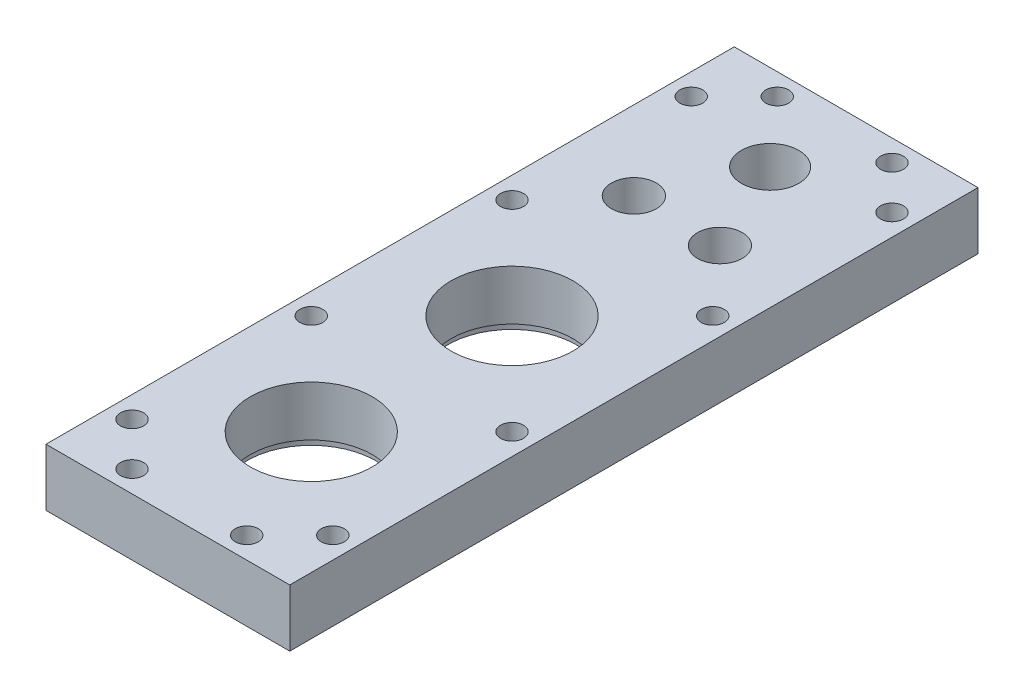
ISO-10303-21;
HEADER;
FILE_DESCRIPTION(('STEP AP214'),'2;1');
FILE_NAME('part.step','',(''),(''),'','','');
FILE_SCHEMA(('AUTOMOTIVE_DESIGN { 1 0 10303 214 1 1 1 1 }'));
ENDSEC;
DATA;
#1=APPLICATION_CONTEXT('core data for automotive mechanical design processes');
#2=APPLICATION_PROTOCOL_DEFINITION('international standard','automotive_design',2000,#1);
#3=PRODUCT_CONTEXT('',#1,'mechanical');
#4=PRODUCT('Part','Part','',(#3));
#5=PRODUCT_RELATED_PRODUCT_CATEGORY('part','',(#4));
#6=PRODUCT_DEFINITION_FORMATION('','',#4);
#7=PRODUCT_DEFINITION_CONTEXT('part definition',#1,'design');
#8=PRODUCT_DEFINITION('design','',#6,#7);
#9=PRODUCT_DEFINITION_SHAPE('','',#8);
#10=(LENGTH_UNIT() NAMED_UNIT(*) SI_UNIT(.MILLI.,.METRE.));
#11=(NAMED_UNIT(*) PLANE_ANGLE_UNIT() SI_UNIT($,.RADIAN.));
#12=(NAMED_UNIT(*) SI_UNIT($,.STERADIAN.) SOLID_ANGLE_UNIT());
#13=UNCERTAINTY_MEASURE_WITH_UNIT(LENGTH_MEASURE(1.E-05),#10,'distance_accuracy_value','');
#14=(GEOMETRIC_REPRESENTATION_CONTEXT(3) GLOBAL_UNCERTAINTY_ASSIGNED_CONTEXT((#13)) GLOBAL_UNIT_ASSIGNED_CONTEXT((#10,
#11,#12)) REPRESENTATION_CONTEXT('',''));
#15=CARTESIAN_POINT('',(0.,0.,0.));
#16=DIRECTION('',(0.,0.,1.));
#17=DIRECTION('',(1.,0.,0.));
#18=AXIS2_PLACEMENT_3D('',#15,#16,#17);
#19=CARTESIAN_POINT('',(0.,0.,-20.));
#20=DIRECTION('',(0.,1.,0.));
#21=DIRECTION('',(-1.,0.,0.));
#22=AXIS2_PLACEMENT_3D('',#19,#20,#21);
#23=CYLINDRICAL_SURFACE('',#22,9.);
#24=CARTESIAN_POINT('',(0.,0.,-20.));
#25=DIRECTION('',(0.,1.,0.));
#26=DIRECTION('',(-1.,0.,0.));
#27=AXIS2_PLACEMENT_3D('',#24,#25,#26);
#28=CIRCLE('',#27,9.);
#29=CARTESIAN_POINT('',(9.,0.,-20.));
#30=VERTEX_POINT('',#29);
#31=EDGE_CURVE('E251',#30,#30,#28,.T.);
#32=ORIENTED_EDGE('',*,*,#31,.F.);
#33=DIRECTION('',(0.,1.,0.));
#34=VECTOR('',#33,1.);
#35=CARTESIAN_POINT('',(9.,0.,-20.));
#36=LINE('',#35,#34);
#37=CARTESIAN_POINT('',(9.,1.,-20.));
#38=VERTEX_POINT('',#37);
#39=EDGE_CURVE('E11',#30,#38,#36,.T.);
#40=ORIENTED_EDGE('',*,*,#39,.T.);
#41=CARTESIAN_POINT('',(0.,1.,-20.));
#42=DIRECTION('',(0.,1.,0.));
#43=DIRECTION('',(-1.,0.,0.));
#44=AXIS2_PLACEMENT_3D('',#41,#42,#43);
#45=CIRCLE('',#44,9.);
#46=EDGE_CURVE('E28',#38,#38,#45,.T.);
#47=ORIENTED_EDGE('',*,*,#46,.T.);
#48=ORIENTED_EDGE('',*,*,#39,.F.);
#49=EDGE_LOOP('',(#32,#40,#47,#48));
#50=FACE_BOUND('',#49,.T.);
#51=ADVANCED_FACE('F17',(#50),#23,.F.);
#52=CARTESIAN_POINT('',(0.,1.,-20.));
#53=DIRECTION('',(0.,1.,0.));
#54=DIRECTION('',(1.,0.,0.));
#55=AXIS2_PLACEMENT_3D('',#52,#53,#54);
#56=PLANE('',#55);
#57=CARTESIAN_POINT('',(0.,1.,-20.));
#58=DIRECTION('',(0.,1.,0.));
#59=DIRECTION('',(1.,0.,0.));
#60=AXIS2_PLACEMENT_3D('',#57,#58,#59);
#61=CIRCLE('',#60,8.5);
#62=CARTESIAN_POINT('',(-8.5,1.,-20.));
#63=VERTEX_POINT('',#62);
#64=EDGE_CURVE('E358',#63,#63,#61,.T.);
#65=ORIENTED_EDGE('',*,*,#64,.T.);
#66=EDGE_LOOP('',(#65));
#67=FACE_BOUND('',#66,.T.);
#68=ORIENTED_EDGE('',*,*,#46,.F.);
#69=EDGE_LOOP('',(#68));
#70=FACE_BOUND('',#69,.T.);
#71=ADVANCED_FACE('F612',(#67,#70),#56,.F.);
#72=CARTESIAN_POINT('',(0.,-5.762681024821,-20.));
#73=DIRECTION('',(0.,1.,0.));
#74=DIRECTION('',(1.,0.,0.));
#75=AXIS2_PLACEMENT_3D('',#72,#73,#74);
#76=CYLINDRICAL_SURFACE('',#75,8.5);
#77=ORIENTED_EDGE('',*,*,#64,.F.);
#78=DIRECTION('',(0.,1.,0.));
#79=VECTOR('',#78,1.);
#80=CARTESIAN_POINT('',(-8.5,-5.762681024821,-20.));
#81=LINE('',#80,#79);
#82=CARTESIAN_POINT('',(-8.5,8.,-20.));
#83=VERTEX_POINT('',#82);
#84=EDGE_CURVE('E411',#63,#83,#81,.T.);
#85=ORIENTED_EDGE('',*,*,#84,.T.);
#86=CARTESIAN_POINT('',(0.,8.,-20.));
#87=DIRECTION('',(0.,1.,0.));
#88=DIRECTION('',(1.,0.,0.));
#89=AXIS2_PLACEMENT_3D('',#86,#87,#88);
#90=CIRCLE('',#89,8.5);
#91=EDGE_CURVE('E281',#83,#83,#90,.T.);
#92=ORIENTED_EDGE('',*,*,#91,.T.);
#93=ORIENTED_EDGE('',*,*,#84,.F.);
#94=EDGE_LOOP('',(#77,#85,#92,#93));
#95=FACE_BOUND('',#94,.T.);
#96=ADVANCED_FACE('F19',(#95),#76,.F.);
#97=CARTESIAN_POINT('',(0.,0.,-48.));
#98=DIRECTION('',(0.,1.,0.));
#99=DIRECTION('',(-1.,0.,0.));
#100=AXIS2_PLACEMENT_3D('',#97,#98,#99);
#101=CYLINDRICAL_SURFACE('',#100,9.);
#102=CARTESIAN_POINT('',(0.,0.,-48.));
#103=DIRECTION('',(0.,1.,0.));
#104=DIRECTION('',(-1.,0.,0.));
#105=AXIS2_PLACEMENT_3D('',#102,#103,#104);
#106=CIRCLE('',#105,9.);
#107=CARTESIAN_POINT('',(9.,0.,-48.));
#108=VERTEX_POINT('',#107);
#109=EDGE_CURVE('E241',#108,#108,#106,.T.);
#110=ORIENTED_EDGE('',*,*,#109,.F.);
#111=DIRECTION('',(0.,1.,0.));
#112=VECTOR('',#111,1.);
#113=CARTESIAN_POINT('',(9.,0.,-48.));
#114=LINE('',#113,#112);
#115=CARTESIAN_POINT('',(9.,1.,-48.));
#116=VERTEX_POINT('',#115);
#117=EDGE_CURVE('E307',#108,#116,#114,.T.);
#118=ORIENTED_EDGE('',*,*,#117,.T.);
#119=CARTESIAN_POINT('',(0.,1.,-48.));
#120=DIRECTION('',(0.,1.,0.));
#121=DIRECTION('',(-1.,0.,0.));
#122=AXIS2_PLACEMENT_3D('',#119,#120,#121);
#123=CIRCLE('',#122,9.);
#124=EDGE_CURVE('E303',#116,#116,#123,.T.);
#125=ORIENTED_EDGE('',*,*,#124,.T.);
#126=ORIENTED_EDGE('',*,*,#117,.F.);
#127=EDGE_LOOP('',(#110,#118,#125,#126));
#128=FACE_BOUND('',#127,.T.);
#129=ADVANCED_FACE('F697',(#128),#101,.F.);
#130=CARTESIAN_POINT('',(0.,1.,-48.));
#131=DIRECTION('',(0.,1.,0.));
#132=DIRECTION('',(1.,0.,0.));
#133=AXIS2_PLACEMENT_3D('',#130,#131,#132);
#134=PLANE('',#133);
#135=CARTESIAN_POINT('',(0.,1.,-48.));
#136=DIRECTION('',(0.,1.,0.));
#137=DIRECTION('',(1.,0.,0.));
#138=AXIS2_PLACEMENT_3D('',#135,#136,#137);
#139=CIRCLE('',#138,8.5);
#140=CARTESIAN_POINT('',(-8.5,1.,-48.));
#141=VERTEX_POINT('',#140);
#142=EDGE_CURVE('E398',#141,#141,#139,.T.);
#143=ORIENTED_EDGE('',*,*,#142,.T.);
#144=EDGE_LOOP('',(#143));
#145=FACE_BOUND('',#144,.T.);
#146=ORIENTED_EDGE('',*,*,#124,.F.);
#147=EDGE_LOOP('',(#146));
#148=FACE_BOUND('',#147,.T.);
#149=ADVANCED_FACE('F639',(#145,#148),#134,.F.);
#150=CARTESIAN_POINT('',(0.,-5.762681024821,-48.));
#151=DIRECTION('',(0.,1.,0.));
#152=DIRECTION('',(1.,0.,0.));
#153=AXIS2_PLACEMENT_3D('',#150,#151,#152);
#154=CYLINDRICAL_SURFACE('',#153,8.5);
#155=ORIENTED_EDGE('',*,*,#142,.F.);
#156=DIRECTION('',(0.,1.,0.));
#157=VECTOR('',#156,1.);
#158=CARTESIAN_POINT('',(-8.5,-5.762681024821,-48.));
#159=LINE('',#158,#157);
#160=CARTESIAN_POINT('',(-8.5,8.,-48.));
#161=VERTEX_POINT('',#160);
#162=EDGE_CURVE('E308',#141,#161,#159,.T.);
#163=ORIENTED_EDGE('',*,*,#162,.T.);
#164=CARTESIAN_POINT('',(0.,8.,-48.));
#165=DIRECTION('',(0.,1.,0.));
#166=DIRECTION('',(1.,0.,0.));
#167=AXIS2_PLACEMENT_3D('',#164,#165,#166);
#168=CIRCLE('',#167,8.5);
#169=EDGE_CURVE('E286',#161,#161,#168,.T.);
#170=ORIENTED_EDGE('',*,*,#169,.T.);
#171=ORIENTED_EDGE('',*,*,#162,.F.);
#172=EDGE_LOOP('',(#155,#163,#170,#171));
#173=FACE_BOUND('',#172,.T.);
#174=ADVANCED_FACE('F704',(#173),#154,.F.);
#175=CARTESIAN_POINT('',(6.,0.,-71.));
#176=DIRECTION('',(0.,1.,0.));
#177=DIRECTION('',(-1.,0.,0.));
#178=AXIS2_PLACEMENT_3D('',#175,#176,#177);
#179=CYLINDRICAL_SURFACE('',#178,3.6);
#180=CARTESIAN_POINT('',(6.,0.,-71.));
#181=DIRECTION('',(0.,1.,0.));
#182=DIRECTION('',(-1.,0.,0.));
#183=AXIS2_PLACEMENT_3D('',#180,#181,#182);
#184=CIRCLE('',#183,3.6);
#185=CARTESIAN_POINT('',(9.6,0.,-71.));
#186=VERTEX_POINT('',#185);
#187=EDGE_CURVE('E215',#186,#186,#184,.T.);
#188=ORIENTED_EDGE('',*,*,#187,.F.);
#189=DIRECTION('',(0.,1.,0.));
#190=VECTOR('',#189,1.);
#191=CARTESIAN_POINT('',(9.6,0.,-71.));
#192=LINE('',#191,#190);
#193=CARTESIAN_POINT('',(9.6,1.,-71.));
#194=VERTEX_POINT('',#193);
#195=EDGE_CURVE('E237',#186,#194,#192,.T.);
#196=ORIENTED_EDGE('',*,*,#195,.T.);
#197=CARTESIAN_POINT('',(6.,1.,-71.));
#198=DIRECTION('',(0.,1.,0.));
#199=DIRECTION('',(-1.,0.,0.));
#200=AXIS2_PLACEMENT_3D('',#197,#198,#199);
#201=CIRCLE('',#200,3.6);
#202=EDGE_CURVE('E233',#194,#194,#201,.T.);
#203=ORIENTED_EDGE('',*,*,#202,.T.);
#204=ORIENTED_EDGE('',*,*,#195,.F.);
#205=EDGE_LOOP('',(#188,#196,#203,#204));
#206=FACE_BOUND('',#205,.T.);
#207=ADVANCED_FACE('F662',(#206),#179,.F.);
#208=CARTESIAN_POINT('',(6.,1.,-71.));
#209=DIRECTION('',(0.,1.,0.));
#210=DIRECTION('',(1.,0.,0.));
#211=AXIS2_PLACEMENT_3D('',#208,#209,#210);
#212=PLANE('',#211);
#213=CARTESIAN_POINT('',(6.,1.,-71.));
#214=DIRECTION('',(0.,1.,0.));
#215=DIRECTION('',(1.,0.,0.));
#216=AXIS2_PLACEMENT_3D('',#213,#214,#215);
#217=CIRCLE('',#216,3.125);
#218=CARTESIAN_POINT('',(2.875,1.,-71.));
#219=VERTEX_POINT('',#218);
#220=EDGE_CURVE('E243',#219,#219,#217,.T.);
#221=ORIENTED_EDGE('',*,*,#220,.T.);
#222=EDGE_LOOP('',(#221));
#223=FACE_BOUND('',#222,.T.);
#224=ORIENTED_EDGE('',*,*,#202,.F.);
#225=EDGE_LOOP('',(#224));
#226=FACE_BOUND('',#225,.T.);
#227=ADVANCED_FACE('F655',(#223,#226),#212,.F.);
#228=CARTESIAN_POINT('',(6.,-2.371573906184,-71.));
#229=DIRECTION('',(0.,1.,0.));
#230=DIRECTION('',(1.,0.,0.));
#231=AXIS2_PLACEMENT_3D('',#228,#229,#230);
#232=CYLINDRICAL_SURFACE('',#231,3.125);
#233=ORIENTED_EDGE('',*,*,#220,.F.);
#234=DIRECTION('',(0.,1.,0.));
#235=VECTOR('',#234,1.);
#236=CARTESIAN_POINT('',(2.875,-2.371573906184,-71.));
#237=LINE('',#236,#235);
#238=CARTESIAN_POINT('',(2.875,8.,-71.));
#239=VERTEX_POINT('',#238);
#240=EDGE_CURVE('E238',#219,#239,#237,.T.);
#241=ORIENTED_EDGE('',*,*,#240,.T.);
#242=CARTESIAN_POINT('',(6.,8.,-71.));
#243=DIRECTION('',(0.,1.,0.));
#244=DIRECTION('',(1.,0.,0.));
#245=AXIS2_PLACEMENT_3D('',#242,#243,#244);
#246=CIRCLE('',#245,3.125);
#247=EDGE_CURVE('E256',#239,#239,#246,.T.);
#248=ORIENTED_EDGE('',*,*,#247,.T.);
#249=ORIENTED_EDGE('',*,*,#240,.F.);
#250=EDGE_LOOP('',(#233,#241,#248,#249));
#251=FACE_BOUND('',#250,.T.);
#252=ADVANCED_FACE('F653',(#251),#232,.F.);
#253=CARTESIAN_POINT('',(-6.,0.,-71.));
#254=DIRECTION('',(0.,1.,0.));
#255=DIRECTION('',(-1.,0.,0.));
#256=AXIS2_PLACEMENT_3D('',#253,#254,#255);
#257=CYLINDRICAL_SURFACE('',#256,3.6);
#258=CARTESIAN_POINT('',(-6.,0.,-71.));
#259=DIRECTION('',(0.,1.,0.));
#260=DIRECTION('',(-1.,0.,0.));
#261=AXIS2_PLACEMENT_3D('',#258,#259,#260);
#262=CIRCLE('',#261,3.6);
#263=CARTESIAN_POINT('',(-2.4,0.,-71.));
#264=VERTEX_POINT('',#263);
#265=EDGE_CURVE('E211',#264,#264,#262,.T.);
#266=ORIENTED_EDGE('',*,*,#265,.F.);
#267=DIRECTION('',(0.,1.,0.));
#268=VECTOR('',#267,1.);
#269=CARTESIAN_POINT('',(-2.4,0.,-71.));
#270=LINE('',#269,#268);
#271=CARTESIAN_POINT('',(-2.4,1.,-71.));
#272=VERTEX_POINT('',#271);
#273=EDGE_CURVE('E247',#264,#272,#270,.T.);
#274=ORIENTED_EDGE('',*,*,#273,.T.);
#275=CARTESIAN_POINT('',(-6.,1.,-71.));
#276=DIRECTION('',(0.,1.,0.));
#277=DIRECTION('',(-1.,0.,0.));
#278=AXIS2_PLACEMENT_3D('',#275,#276,#277);
#279=CIRCLE('',#278,3.6);
#280=EDGE_CURVE('E375',#272,#272,#279,.T.);
#281=ORIENTED_EDGE('',*,*,#280,.T.);
#282=ORIENTED_EDGE('',*,*,#273,.F.);
#283=EDGE_LOOP('',(#266,#274,#281,#282));
#284=FACE_BOUND('',#283,.T.);
#285=ADVANCED_FACE('F564',(#284),#257,.F.);
#286=CARTESIAN_POINT('',(-6.,1.,-71.));
#287=DIRECTION('',(0.,1.,0.));
#288=DIRECTION('',(1.,0.,0.));
#289=AXIS2_PLACEMENT_3D('',#286,#287,#288);
#290=PLANE('',#289);
#291=CARTESIAN_POINT('',(-6.,1.,-71.));
#292=DIRECTION('',(0.,1.,0.));
#293=DIRECTION('',(1.,0.,0.));
#294=AXIS2_PLACEMENT_3D('',#291,#292,#293);
#295=CIRCLE('',#294,3.125);
#296=CARTESIAN_POINT('',(-9.125,1.,-71.));
#297=VERTEX_POINT('',#296);
#298=EDGE_CURVE('E258',#297,#297,#295,.T.);
#299=ORIENTED_EDGE('',*,*,#298,.T.);
#300=EDGE_LOOP('',(#299));
#301=FACE_BOUND('',#300,.T.);
#302=ORIENTED_EDGE('',*,*,#280,.F.);
#303=EDGE_LOOP('',(#302));
#304=FACE_BOUND('',#303,.T.);
#305=ADVANCED_FACE('F561',(#301,#304),#290,.F.);
#306=CARTESIAN_POINT('',(-6.,-2.371573906184,-71.));
#307=DIRECTION('',(0.,1.,0.));
#308=DIRECTION('',(1.,0.,0.));
#309=AXIS2_PLACEMENT_3D('',#306,#307,#308);
#310=CYLINDRICAL_SURFACE('',#309,3.125);
#311=ORIENTED_EDGE('',*,*,#298,.F.);
#312=DIRECTION('',(0.,1.,0.));
#313=VECTOR('',#312,1.);
#314=CARTESIAN_POINT('',(-9.125,-2.371573906184,-71.));
#315=LINE('',#314,#313);
#316=CARTESIAN_POINT('',(-9.125,8.,-71.));
#317=VERTEX_POINT('',#316);
#318=EDGE_CURVE('E262',#297,#317,#315,.T.);
#319=ORIENTED_EDGE('',*,*,#318,.T.);
#320=CARTESIAN_POINT('',(-6.,8.,-71.));
#321=DIRECTION('',(0.,1.,0.));
#322=DIRECTION('',(1.,0.,0.));
#323=AXIS2_PLACEMENT_3D('',#320,#321,#322);
#324=CIRCLE('',#323,3.125);
#325=EDGE_CURVE('E252',#317,#317,#324,.T.);
#326=ORIENTED_EDGE('',*,*,#325,.T.);
#327=ORIENTED_EDGE('',*,*,#318,.F.);
#328=EDGE_LOOP('',(#311,#319,#326,#327));
#329=FACE_BOUND('',#328,.T.);
#330=ADVANCED_FACE('F557',(#329),#310,.F.);
#331=CARTESIAN_POINT('',(0.,0.,-84.));
#332=DIRECTION('',(0.,1.,0.));
#333=DIRECTION('',(-1.,0.,0.));
#334=AXIS2_PLACEMENT_3D('',#331,#332,#333);
#335=CYLINDRICAL_SURFACE('',#334,5.1);
#336=CARTESIAN_POINT('',(0.,0.,-84.));
#337=DIRECTION('',(0.,1.,0.));
#338=DIRECTION('',(-1.,0.,0.));
#339=AXIS2_PLACEMENT_3D('',#336,#337,#338);
#340=CIRCLE('',#339,5.1);
#341=CARTESIAN_POINT('',(5.1,0.,-84.));
#342=VERTEX_POINT('',#341);
#343=EDGE_CURVE('E216',#342,#342,#340,.T.);
#344=ORIENTED_EDGE('',*,*,#343,.F.);
#345=DIRECTION('',(0.,1.,0.));
#346=VECTOR('',#345,1.);
#347=CARTESIAN_POINT('',(5.1,0.,-84.));
#348=LINE('',#347,#346);
#349=CARTESIAN_POINT('',(5.1,1.,-84.));
#350=VERTEX_POINT('',#349);
#351=EDGE_CURVE('E263',#342,#350,#348,.T.);
#352=ORIENTED_EDGE('',*,*,#351,.T.);
#353=CARTESIAN_POINT('',(0.,1.,-84.));
#354=DIRECTION('',(0.,1.,0.));
#355=DIRECTION('',(-1.,0.,0.));
#356=AXIS2_PLACEMENT_3D('',#353,#354,#355);
#357=CIRCLE('',#356,5.1);
#358=EDGE_CURVE('E331',#350,#350,#357,.T.);
#359=ORIENTED_EDGE('',*,*,#358,.T.);
#360=ORIENTED_EDGE('',*,*,#351,.F.);
#361=EDGE_LOOP('',(#344,#352,#359,#360));
#362=FACE_BOUND('',#361,.T.);
#363=ADVANCED_FACE('F623',(#362),#335,.F.);
#364=CARTESIAN_POINT('',(0.,1.,-84.));
#365=DIRECTION('',(0.,1.,0.));
#366=DIRECTION('',(1.,0.,0.));
#367=AXIS2_PLACEMENT_3D('',#364,#365,#366);
#368=PLANE('',#367);
#369=CARTESIAN_POINT('',(0.,1.,-84.));
#370=DIRECTION('',(0.,1.,0.));
#371=DIRECTION('',(1.,0.,0.));
#372=AXIS2_PLACEMENT_3D('',#369,#370,#371);
#373=CIRCLE('',#372,4.);
#374=CARTESIAN_POINT('',(-4.,1.,-84.));
#375=VERTEX_POINT('',#374);
#376=EDGE_CURVE('E227',#375,#375,#373,.T.);
#377=ORIENTED_EDGE('',*,*,#376,.T.);
#378=EDGE_LOOP('',(#377));
#379=FACE_BOUND('',#378,.T.);
#380=ORIENTED_EDGE('',*,*,#358,.F.);
#381=EDGE_LOOP('',(#380));
#382=FACE_BOUND('',#381,.T.);
#383=ADVANCED_FACE('F625',(#379,#382),#368,.F.);
#384=CARTESIAN_POINT('',(0.,-2.923614599916,-84.));
#385=DIRECTION('',(0.,1.,0.));
#386=DIRECTION('',(1.,0.,0.));
#387=AXIS2_PLACEMENT_3D('',#384,#385,#386);
#388=CYLINDRICAL_SURFACE('',#387,4.);
#389=ORIENTED_EDGE('',*,*,#376,.F.);
#390=DIRECTION('',(0.,1.,0.));
#391=VECTOR('',#390,1.);
#392=CARTESIAN_POINT('',(-4.,-2.923614599916,-84.));
#393=LINE('',#392,#391);
#394=CARTESIAN_POINT('',(-4.,8.,-84.));
#395=VERTEX_POINT('',#394);
#396=EDGE_CURVE('E231',#375,#395,#393,.T.);
#397=ORIENTED_EDGE('',*,*,#396,.T.);
#398=CARTESIAN_POINT('',(0.,8.,-84.));
#399=DIRECTION('',(0.,1.,0.));
#400=DIRECTION('',(1.,0.,0.));
#401=AXIS2_PLACEMENT_3D('',#398,#399,#400);
#402=CIRCLE('',#401,4.);
#403=EDGE_CURVE('E257',#395,#395,#402,.T.);
#404=ORIENTED_EDGE('',*,*,#403,.T.);
#405=ORIENTED_EDGE('',*,*,#396,.F.);
#406=EDGE_LOOP('',(#389,#397,#404,#405));
#407=FACE_BOUND('',#406,.T.);
#408=ADVANCED_FACE('F801',(#407),#388,.F.);
#409=CARTESIAN_POINT('',(-14.,0.,-34.));
#410=DIRECTION('',(0.,1.,0.));
#411=DIRECTION('',(-1.,0.,0.));
#412=AXIS2_PLACEMENT_3D('',#409,#410,#411);
#413=CYLINDRICAL_SURFACE('',#412,1.6);
#414=CARTESIAN_POINT('',(-14.,0.,-34.));
#415=DIRECTION('',(0.,1.,0.));
#416=DIRECTION('',(-1.,0.,0.));
#417=AXIS2_PLACEMENT_3D('',#414,#415,#416);
#418=CIRCLE('',#417,1.6);
#419=CARTESIAN_POINT('',(-12.4,0.,-34.));
#420=VERTEX_POINT('',#419);
#421=EDGE_CURVE('E276',#420,#420,#418,.T.);
#422=ORIENTED_EDGE('',*,*,#421,.F.);
#423=DIRECTION('',(0.,1.,0.));
#424=VECTOR('',#423,1.);
#425=CARTESIAN_POINT('',(-12.4,0.,-34.));
#426=LINE('',#425,#424);
#427=CARTESIAN_POINT('',(-12.4,8.,-34.));
#428=VERTEX_POINT('',#427);
#429=EDGE_CURVE('E232',#420,#428,#426,.T.);
#430=ORIENTED_EDGE('',*,*,#429,.T.);
#431=CARTESIAN_POINT('',(-14.,8.,-34.));
#432=DIRECTION('',(0.,1.,0.));
#433=DIRECTION('',(-1.,0.,0.));
#434=AXIS2_PLACEMENT_3D('',#431,#432,#433);
#435=CIRCLE('',#434,1.6);
#436=EDGE_CURVE('E316',#428,#428,#435,.T.);
#437=ORIENTED_EDGE('',*,*,#436,.T.);
#438=ORIENTED_EDGE('',*,*,#429,.F.);
#439=EDGE_LOOP('',(#422,#430,#437,#438));
#440=FACE_BOUND('',#439,.T.);
#441=ADVANCED_FACE('F796',(#440),#413,.F.);
#442=CARTESIAN_POINT('',(-14.,0.,-9.));
#443=DIRECTION('',(0.,1.,0.));
#444=DIRECTION('',(-1.,0.,0.));
#445=AXIS2_PLACEMENT_3D('',#442,#443,#444);
#446=CYLINDRICAL_SURFACE('',#445,1.6);
#447=CARTESIAN_POINT('',(-14.,0.,-9.));
#448=DIRECTION('',(0.,1.,0.));
#449=DIRECTION('',(-1.,0.,0.));
#450=AXIS2_PLACEMENT_3D('',#447,#448,#449);
#451=CIRCLE('',#450,1.6);
#452=CARTESIAN_POINT('',(-12.4,0.,-9.));
#453=VERTEX_POINT('',#452);
#454=EDGE_CURVE('E280',#453,#453,#451,.T.);
#455=ORIENTED_EDGE('',*,*,#454,.F.);
#456=DIRECTION('',(0.,1.,0.));
#457=VECTOR('',#456,1.);
#458=CARTESIAN_POINT('',(-12.4,0.,-9.));
#459=LINE('',#458,#457);
#460=CARTESIAN_POINT('',(-12.4,8.,-9.));
#461=VERTEX_POINT('',#460);
#462=EDGE_CURVE('E354',#453,#461,#459,.T.);
#463=ORIENTED_EDGE('',*,*,#462,.T.);
#464=CARTESIAN_POINT('',(-14.,8.,-9.));
#465=DIRECTION('',(0.,1.,0.));
#466=DIRECTION('',(-1.,0.,0.));
#467=AXIS2_PLACEMENT_3D('',#464,#465,#466);
#468=CIRCLE('',#467,1.6);
#469=EDGE_CURVE('E312',#461,#461,#468,.T.);
#470=ORIENTED_EDGE('',*,*,#469,.T.);
#471=ORIENTED_EDGE('',*,*,#462,.F.);
#472=EDGE_LOOP('',(#455,#463,#470,#471));
#473=FACE_BOUND('',#472,.T.);
#474=ADVANCED_FACE('F694',(#473),#446,.F.);
#475=CARTESIAN_POINT('',(14.,0.,-34.));
#476=DIRECTION('',(0.,1.,0.));
#477=DIRECTION('',(-1.,0.,0.));
#478=AXIS2_PLACEMENT_3D('',#475,#476,#477);
#479=CYLINDRICAL_SURFACE('',#478,1.6);
#480=CARTESIAN_POINT('',(14.,0.,-34.));
#481=DIRECTION('',(0.,1.,0.));
#482=DIRECTION('',(-1.,0.,0.));
#483=AXIS2_PLACEMENT_3D('',#480,#481,#482);
#484=CIRCLE('',#483,1.6);
#485=CARTESIAN_POINT('',(15.6,0.,-34.));
#486=VERTEX_POINT('',#485);
#487=EDGE_CURVE('E287',#486,#486,#484,.T.);
#488=ORIENTED_EDGE('',*,*,#487,.F.);
#489=DIRECTION('',(0.,1.,0.));
#490=VECTOR('',#489,1.);
#491=CARTESIAN_POINT('',(15.6,0.,-34.));
#492=LINE('',#491,#490);
#493=CARTESIAN_POINT('',(15.6,8.,-34.));
#494=VERTEX_POINT('',#493);
#495=EDGE_CURVE('E389',#486,#494,#492,.T.);
#496=ORIENTED_EDGE('',*,*,#495,.T.);
#497=CARTESIAN_POINT('',(14.,8.,-34.));
#498=DIRECTION('',(0.,1.,0.));
#499=DIRECTION('',(-1.,0.,0.));
#500=AXIS2_PLACEMENT_3D('',#497,#498,#499);
#501=CIRCLE('',#500,1.6);
#502=EDGE_CURVE('E268',#494,#494,#501,.T.);
#503=ORIENTED_EDGE('',*,*,#502,.T.);
#504=ORIENTED_EDGE('',*,*,#495,.F.);
#505=EDGE_LOOP('',(#488,#496,#503,#504));
#506=FACE_BOUND('',#505,.T.);
#507=ADVANCED_FACE('F455',(#506),#479,.F.);
#508=CARTESIAN_POINT('',(14.,0.,-9.));
#509=DIRECTION('',(0.,1.,0.));
#510=DIRECTION('',(-1.,0.,0.));
#511=AXIS2_PLACEMENT_3D('',#508,#509,#510);
#512=CYLINDRICAL_SURFACE('',#511,1.6);
#513=CARTESIAN_POINT('',(14.,0.,-9.));
#514=DIRECTION('',(0.,1.,0.));
#515=DIRECTION('',(-1.,0.,0.));
#516=AXIS2_PLACEMENT_3D('',#513,#514,#515);
#517=CIRCLE('',#516,1.6);
#518=CARTESIAN_POINT('',(15.6,0.,-9.));
#519=VERTEX_POINT('',#518);
#520=EDGE_CURVE('E291',#519,#519,#517,.T.);
#521=ORIENTED_EDGE('',*,*,#520,.F.);
#522=DIRECTION('',(0.,1.,0.));
#523=VECTOR('',#522,1.);
#524=CARTESIAN_POINT('',(15.6,0.,-9.));
#525=LINE('',#524,#523);
#526=CARTESIAN_POINT('',(15.6,8.,-9.));
#527=VERTEX_POINT('',#526);
#528=EDGE_CURVE('E397',#519,#527,#525,.T.);
#529=ORIENTED_EDGE('',*,*,#528,.T.);
#530=CARTESIAN_POINT('',(14.,8.,-9.));
#531=DIRECTION('',(0.,1.,0.));
#532=DIRECTION('',(-1.,0.,0.));
#533=AXIS2_PLACEMENT_3D('',#530,#531,#532);
#534=CIRCLE('',#533,1.6);
#535=EDGE_CURVE('E264',#527,#527,#534,.T.);
#536=ORIENTED_EDGE('',*,*,#535,.T.);
#537=ORIENTED_EDGE('',*,*,#528,.F.);
#538=EDGE_LOOP('',(#521,#529,#536,#537));
#539=FACE_BOUND('',#538,.T.);
#540=ADVANCED_FACE('F685',(#539),#512,.F.);
#541=CARTESIAN_POINT('',(-14.,0.,-62.));
#542=DIRECTION('',(0.,1.,0.));
#543=DIRECTION('',(-1.,0.,0.));
#544=AXIS2_PLACEMENT_3D('',#541,#542,#543);
#545=CYLINDRICAL_SURFACE('',#544,1.6);
#546=CARTESIAN_POINT('',(-14.,0.,-62.));
#547=DIRECTION('',(0.,1.,0.));
#548=DIRECTION('',(-1.,0.,0.));
#549=AXIS2_PLACEMENT_3D('',#546,#547,#548);
#550=CIRCLE('',#549,1.6);
#551=CARTESIAN_POINT('',(-12.4,0.,-62.));
#552=VERTEX_POINT('',#551);
#553=EDGE_CURVE('E274',#552,#552,#550,.T.);
#554=ORIENTED_EDGE('',*,*,#553,.F.);
#555=DIRECTION('',(0.,1.,0.));
#556=VECTOR('',#555,1.);
#557=CARTESIAN_POINT('',(-12.4,0.,-62.));
#558=LINE('',#557,#556);
#559=CARTESIAN_POINT('',(-12.4,8.,-62.));
#560=VERTEX_POINT('',#559);
#561=EDGE_CURVE('E393',#552,#560,#558,.T.);
#562=ORIENTED_EDGE('',*,*,#561,.T.);
#563=CARTESIAN_POINT('',(-14.,8.,-62.));
#564=DIRECTION('',(0.,1.,0.));
#565=DIRECTION('',(-1.,0.,0.));
#566=AXIS2_PLACEMENT_3D('',#563,#564,#565);
#567=CIRCLE('',#566,1.6);
#568=EDGE_CURVE('E269',#560,#560,#567,.T.);
#569=ORIENTED_EDGE('',*,*,#568,.T.);
#570=ORIENTED_EDGE('',*,*,#561,.F.);
#571=EDGE_LOOP('',(#554,#562,#569,#570));
#572=FACE_BOUND('',#571,.T.);
#573=ADVANCED_FACE('F621',(#572),#545,.F.);
#574=CARTESIAN_POINT('',(14.,0.,-62.));
#575=DIRECTION('',(0.,1.,0.));
#576=DIRECTION('',(-1.,0.,0.));
#577=AXIS2_PLACEMENT_3D('',#574,#575,#576);
#578=CYLINDRICAL_SURFACE('',#577,1.6);
#579=CARTESIAN_POINT('',(14.,0.,-62.));
#580=DIRECTION('',(0.,1.,0.));
#581=DIRECTION('',(-1.,0.,0.));
#582=AXIS2_PLACEMENT_3D('',#579,#580,#581);
#583=CIRCLE('',#582,1.6);
#584=CARTESIAN_POINT('',(15.6,0.,-62.));
#585=VERTEX_POINT('',#584);
#586=EDGE_CURVE('E270',#585,#585,#583,.T.);
#587=ORIENTED_EDGE('',*,*,#586,.F.);
#588=DIRECTION('',(0.,1.,0.));
#589=VECTOR('',#588,1.);
#590=CARTESIAN_POINT('',(15.6,0.,-62.));
#591=LINE('',#590,#589);
#592=CARTESIAN_POINT('',(15.6,8.,-62.));
#593=VERTEX_POINT('',#592);
#594=EDGE_CURVE('E298',#585,#593,#591,.T.);
#595=ORIENTED_EDGE('',*,*,#594,.T.);
#596=CARTESIAN_POINT('',(14.,8.,-62.));
#597=DIRECTION('',(0.,1.,0.));
#598=DIRECTION('',(-1.,0.,0.));
#599=AXIS2_PLACEMENT_3D('',#596,#597,#598);
#600=CIRCLE('',#599,1.6);
#601=EDGE_CURVE('E317',#593,#593,#600,.T.);
#602=ORIENTED_EDGE('',*,*,#601,.T.);
#603=ORIENTED_EDGE('',*,*,#594,.F.);
#604=EDGE_LOOP('',(#587,#595,#602,#603));
#605=FACE_BOUND('',#604,.T.);
#606=ADVANCED_FACE('F582',(#605),#578,.F.);
#607=CARTESIAN_POINT('',(-14.,0.,-87.));
#608=DIRECTION('',(0.,1.,0.));
#609=DIRECTION('',(-1.,0.,0.));
#610=AXIS2_PLACEMENT_3D('',#607,#608,#609);
#611=CYLINDRICAL_SURFACE('',#610,1.6);
#612=CARTESIAN_POINT('',(-14.,0.,-87.));
#613=DIRECTION('',(0.,1.,0.));
#614=DIRECTION('',(-1.,0.,0.));
#615=AXIS2_PLACEMENT_3D('',#612,#613,#614);
#616=CIRCLE('',#615,1.6);
#617=CARTESIAN_POINT('',(-12.4,0.,-87.));
#618=VERTEX_POINT('',#617);
#619=EDGE_CURVE('E275',#618,#618,#616,.T.);
#620=ORIENTED_EDGE('',*,*,#619,.F.);
#621=DIRECTION('',(0.,1.,0.));
#622=VECTOR('',#621,1.);
#623=CARTESIAN_POINT('',(-12.4,0.,-87.));
#624=LINE('',#623,#622);
#625=CARTESIAN_POINT('',(-12.4,8.,-87.));
#626=VERTEX_POINT('',#625);
#627=EDGE_CURVE('E294',#618,#626,#624,.T.);
#628=ORIENTED_EDGE('',*,*,#627,.T.);
#629=CARTESIAN_POINT('',(-14.,8.,-87.));
#630=DIRECTION('',(0.,1.,0.));
#631=DIRECTION('',(-1.,0.,0.));
#632=AXIS2_PLACEMENT_3D('',#629,#630,#631);
#633=CIRCLE('',#632,1.6);
#634=EDGE_CURVE('E321',#626,#626,#633,.T.);
#635=ORIENTED_EDGE('',*,*,#634,.T.);
#636=ORIENTED_EDGE('',*,*,#627,.F.);
#637=EDGE_LOOP('',(#620,#628,#635,#636));
#638=FACE_BOUND('',#637,.T.);
#639=ADVANCED_FACE('F642',(#638),#611,.F.);
#640=CARTESIAN_POINT('',(14.,0.,-87.));
#641=DIRECTION('',(0.,1.,0.));
#642=DIRECTION('',(-1.,0.,0.));
#643=AXIS2_PLACEMENT_3D('',#640,#641,#642);
#644=CYLINDRICAL_SURFACE('',#643,1.6);
#645=CARTESIAN_POINT('',(14.,0.,-87.));
#646=DIRECTION('',(0.,1.,0.));
#647=DIRECTION('',(-1.,0.,0.));
#648=AXIS2_PLACEMENT_3D('',#645,#646,#647);
#649=CIRCLE('',#648,1.6);
#650=CARTESIAN_POINT('',(15.6,0.,-87.));
#651=VERTEX_POINT('',#650);
#652=EDGE_CURVE('E335',#651,#651,#649,.T.);
#653=ORIENTED_EDGE('',*,*,#652,.F.);
#654=DIRECTION('',(0.,1.,0.));
#655=VECTOR('',#654,1.);
#656=CARTESIAN_POINT('',(15.6,0.,-87.));
#657=LINE('',#656,#655);
#658=CARTESIAN_POINT('',(15.6,8.,-87.));
#659=VERTEX_POINT('',#658);
#660=EDGE_CURVE('E299',#651,#659,#657,.T.);
#661=ORIENTED_EDGE('',*,*,#660,.T.);
#662=CARTESIAN_POINT('',(14.,8.,-87.));
#663=DIRECTION('',(0.,1.,0.));
#664=DIRECTION('',(-1.,0.,0.));
#665=AXIS2_PLACEMENT_3D('',#662,#663,#664);
#666=CIRCLE('',#665,1.6);
#667=EDGE_CURVE('E225',#659,#659,#666,.T.);
#668=ORIENTED_EDGE('',*,*,#667,.T.);
#669=ORIENTED_EDGE('',*,*,#660,.F.);
#670=EDGE_LOOP('',(#653,#661,#668,#669));
#671=FACE_BOUND('',#670,.T.);
#672=ADVANCED_FACE('F644',(#671),#644,.F.);
#673=CARTESIAN_POINT('',(-8.,0.,-3.));
#674=DIRECTION('',(0.,1.,0.));
#675=DIRECTION('',(-1.,0.,0.));
#676=AXIS2_PLACEMENT_3D('',#673,#674,#675);
#677=CYLINDRICAL_SURFACE('',#676,1.6);
#678=CARTESIAN_POINT('',(-8.,0.,-3.));
#679=DIRECTION('',(0.,1.,0.));
#680=DIRECTION('',(-1.,0.,0.));
#681=AXIS2_PLACEMENT_3D('',#678,#679,#680);
#682=CIRCLE('',#681,1.6);
#683=CARTESIAN_POINT('',(-6.4,0.,-3.));
#684=VERTEX_POINT('',#683);
#685=EDGE_CURVE('E339',#684,#684,#682,.T.);
#686=ORIENTED_EDGE('',*,*,#685,.F.);
#687=DIRECTION('',(0.,1.,0.));
#688=VECTOR('',#687,1.);
#689=CARTESIAN_POINT('',(-6.4,0.,-3.));
#690=LINE('',#689,#688);
#691=CARTESIAN_POINT('',(-6.4,8.,-3.));
#692=VERTEX_POINT('',#691);
#693=EDGE_CURVE('E21',#684,#692,#690,.T.);
#694=ORIENTED_EDGE('',*,*,#693,.T.);
#695=CARTESIAN_POINT('',(-8.,8.,-3.));
#696=DIRECTION('',(0.,1.,0.));
#697=DIRECTION('',(-1.,0.,0.));
#698=AXIS2_PLACEMENT_3D('',#695,#696,#697);
#699=CIRCLE('',#698,1.6);
#700=EDGE_CURVE('E221',#692,#692,#699,.T.);
#701=ORIENTED_EDGE('',*,*,#700,.T.);
#702=ORIENTED_EDGE('',*,*,#693,.F.);
#703=EDGE_LOOP('',(#686,#694,#701,#702));
#704=FACE_BOUND('',#703,.T.);
#705=ADVANCED_FACE('F606',(#704),#677,.F.);
#706=CARTESIAN_POINT('',(8.,0.,-3.));
#707=DIRECTION('',(0.,1.,0.));
#708=DIRECTION('',(-1.,0.,0.));
#709=AXIS2_PLACEMENT_3D('',#706,#707,#708);
#710=CYLINDRICAL_SURFACE('',#709,1.6);
#711=CARTESIAN_POINT('',(8.,0.,-3.));
#712=DIRECTION('',(0.,1.,0.));
#713=DIRECTION('',(-1.,0.,0.));
#714=AXIS2_PLACEMENT_3D('',#711,#712,#713);
#715=CIRCLE('',#714,1.6);
#716=CARTESIAN_POINT('',(9.6,0.,-3.));
#717=VERTEX_POINT('',#716);
#718=EDGE_CURVE('E370',#717,#717,#715,.T.);
#719=ORIENTED_EDGE('',*,*,#718,.F.);
#720=DIRECTION('',(0.,1.,0.));
#721=VECTOR('',#720,1.);
#722=CARTESIAN_POINT('',(9.6,0.,-3.));
#723=LINE('',#722,#721);
#724=CARTESIAN_POINT('',(9.6,8.,-3.));
#725=VERTEX_POINT('',#724);
#726=EDGE_CURVE('E340',#717,#725,#723,.T.);
#727=ORIENTED_EDGE('',*,*,#726,.T.);
#728=CARTESIAN_POINT('',(8.,8.,-3.));
#729=DIRECTION('',(0.,1.,0.));
#730=DIRECTION('',(-1.,0.,0.));
#731=AXIS2_PLACEMENT_3D('',#728,#729,#730);
#732=CIRCLE('',#731,1.6);
#733=EDGE_CURVE('E226',#725,#725,#732,.T.);
#734=ORIENTED_EDGE('',*,*,#733,.T.);
#735=ORIENTED_EDGE('',*,*,#726,.F.);
#736=EDGE_LOOP('',(#719,#727,#734,#735));
#737=FACE_BOUND('',#736,.T.);
#738=ADVANCED_FACE('F598',(#737),#710,.F.);
#739=CARTESIAN_POINT('',(-8.,0.,-93.));
#740=DIRECTION('',(0.,1.,0.));
#741=DIRECTION('',(-1.,0.,0.));
#742=AXIS2_PLACEMENT_3D('',#739,#740,#741);
#743=CYLINDRICAL_SURFACE('',#742,1.6);
#744=CARTESIAN_POINT('',(-8.,0.,-93.));
#745=DIRECTION('',(0.,1.,0.));
#746=DIRECTION('',(-1.,0.,0.));
#747=AXIS2_PLACEMENT_3D('',#744,#745,#746);
#748=CIRCLE('',#747,1.6);
#749=CARTESIAN_POINT('',(-6.4,0.,-93.));
#750=VERTEX_POINT('',#749);
#751=EDGE_CURVE('E367',#750,#750,#748,.T.);
#752=ORIENTED_EDGE('',*,*,#751,.F.);
#753=DIRECTION('',(0.,1.,0.));
#754=VECTOR('',#753,1.);
#755=CARTESIAN_POINT('',(-6.4,0.,-93.));
#756=LINE('',#755,#754);
#757=CARTESIAN_POINT('',(-6.4,8.,-93.));
#758=VERTEX_POINT('',#757);
#759=EDGE_CURVE('E343',#750,#758,#756,.T.);
#760=ORIENTED_EDGE('',*,*,#759,.T.);
#761=CARTESIAN_POINT('',(-8.,8.,-93.));
#762=DIRECTION('',(0.,1.,0.));
#763=DIRECTION('',(-1.,0.,0.));
#764=AXIS2_PLACEMENT_3D('',#761,#762,#763);
#765=CIRCLE('',#764,1.6);
#766=EDGE_CURVE('E210',#758,#758,#765,.T.);
#767=ORIENTED_EDGE('',*,*,#766,.T.);
#768=ORIENTED_EDGE('',*,*,#759,.F.);
#769=EDGE_LOOP('',(#752,#760,#767,#768));
#770=FACE_BOUND('',#769,.T.);
#771=ADVANCED_FACE('F596',(#770),#743,.F.);
#772=CARTESIAN_POINT('',(8.,0.,-93.));
#773=DIRECTION('',(0.,1.,0.));
#774=DIRECTION('',(-1.,0.,0.));
#775=AXIS2_PLACEMENT_3D('',#772,#773,#774);
#776=CYLINDRICAL_SURFACE('',#775,1.6);
#777=CARTESIAN_POINT('',(8.,0.,-93.));
#778=DIRECTION('',(0.,1.,0.));
#779=DIRECTION('',(-1.,0.,0.));
#780=AXIS2_PLACEMENT_3D('',#777,#778,#779);
#781=CIRCLE('',#780,1.6);
#782=CARTESIAN_POINT('',(9.6,0.,-93.));
#783=VERTEX_POINT('',#782);
#784=EDGE_CURVE('E205',#783,#783,#781,.T.);
#785=ORIENTED_EDGE('',*,*,#784,.F.);
#786=DIRECTION('',(0.,1.,0.));
#787=VECTOR('',#786,1.);
#788=CARTESIAN_POINT('',(9.6,0.,-93.));
#789=LINE('',#788,#787);
#790=CARTESIAN_POINT('',(9.6,8.,-93.));
#791=VERTEX_POINT('',#790);
#792=EDGE_CURVE('E285',#783,#791,#789,.T.);
#793=ORIENTED_EDGE('',*,*,#792,.T.);
#794=CARTESIAN_POINT('',(8.,8.,-93.));
#795=DIRECTION('',(0.,1.,0.));
#796=DIRECTION('',(-1.,0.,0.));
#797=AXIS2_PLACEMENT_3D('',#794,#795,#796);
#798=CIRCLE('',#797,1.6);
#799=EDGE_CURVE('E174',#791,#791,#798,.T.);
#800=ORIENTED_EDGE('',*,*,#799,.T.);
#801=ORIENTED_EDGE('',*,*,#792,.F.);
#802=EDGE_LOOP('',(#785,#793,#800,#801));
#803=FACE_BOUND('',#802,.T.);
#804=ADVANCED_FACE('F459',(#803),#776,.F.);
#805=CARTESIAN_POINT('',(0.,8.,0.));
#806=DIRECTION('',(0.,1.,0.));
#807=DIRECTION('',(1.,0.,0.));
#808=AXIS2_PLACEMENT_3D('',#805,#806,#807);
#809=PLANE('',#808);
#810=ORIENTED_EDGE('',*,*,#91,.F.);
#811=EDGE_LOOP('',(#810));
#812=FACE_BOUND('',#811,.T.);
#813=ORIENTED_EDGE('',*,*,#169,.F.);
#814=EDGE_LOOP('',(#813));
#815=FACE_BOUND('',#814,.T.);
#816=ORIENTED_EDGE('',*,*,#247,.F.);
#817=EDGE_LOOP('',(#816));
#818=FACE_BOUND('',#817,.T.);
#819=ORIENTED_EDGE('',*,*,#325,.F.);
#820=EDGE_LOOP('',(#819));
#821=FACE_BOUND('',#820,.T.);
#822=ORIENTED_EDGE('',*,*,#403,.F.);
#823=EDGE_LOOP('',(#822));
#824=FACE_BOUND('',#823,.T.);
#825=ORIENTED_EDGE('',*,*,#436,.F.);
#826=EDGE_LOOP('',(#825));
#827=FACE_BOUND('',#826,.T.);
#828=ORIENTED_EDGE('',*,*,#469,.F.);
#829=EDGE_LOOP('',(#828));
#830=FACE_BOUND('',#829,.T.);
#831=ORIENTED_EDGE('',*,*,#502,.F.);
#832=EDGE_LOOP('',(#831));
#833=FACE_BOUND('',#832,.T.);
#834=ORIENTED_EDGE('',*,*,#535,.F.);
#835=EDGE_LOOP('',(#834));
#836=FACE_BOUND('',#835,.T.);
#837=ORIENTED_EDGE('',*,*,#568,.F.);
#838=EDGE_LOOP('',(#837));
#839=FACE_BOUND('',#838,.T.);
#840=ORIENTED_EDGE('',*,*,#601,.F.);
#841=EDGE_LOOP('',(#840));
#842=FACE_BOUND('',#841,.T.);
#843=ORIENTED_EDGE('',*,*,#634,.F.);
#844=EDGE_LOOP('',(#843));
#845=FACE_BOUND('',#844,.T.);
#846=ORIENTED_EDGE('',*,*,#667,.F.);
#847=EDGE_LOOP('',(#846));
#848=FACE_BOUND('',#847,.T.);
#849=ORIENTED_EDGE('',*,*,#700,.F.);
#850=EDGE_LOOP('',(#849));
#851=FACE_BOUND('',#850,.T.);
#852=ORIENTED_EDGE('',*,*,#733,.F.);
#853=EDGE_LOOP('',(#852));
#854=FACE_BOUND('',#853,.T.);
#855=ORIENTED_EDGE('',*,*,#766,.F.);
#856=EDGE_LOOP('',(#855));
#857=FACE_BOUND('',#856,.T.);
#858=ORIENTED_EDGE('',*,*,#799,.F.);
#859=EDGE_LOOP('',(#858));
#860=FACE_BOUND('',#859,.T.);
#861=DIRECTION('',(0.,0.,1.));
#862=VECTOR('',#861,1.);
#863=CARTESIAN_POINT('',(-17.,8.,-96.));
#864=LINE('',#863,#862);
#865=CARTESIAN_POINT('',(-17.,8.,-96.));
#866=VERTEX_POINT('',#865);
#867=CARTESIAN_POINT('',(-17.,8.,0.));
#868=VERTEX_POINT('',#867);
#869=EDGE_CURVE('E169',#866,#868,#864,.T.);
#870=ORIENTED_EDGE('',*,*,#869,.T.);
#871=DIRECTION('',(1.,0.,0.));
#872=VECTOR('',#871,1.);
#873=CARTESIAN_POINT('',(-17.,8.,0.));
#874=LINE('',#873,#872);
#875=CARTESIAN_POINT('',(17.,8.,0.));
#876=VERTEX_POINT('',#875);
#877=EDGE_CURVE('E162',#868,#876,#874,.T.);
#878=ORIENTED_EDGE('',*,*,#877,.T.);
#879=DIRECTION('',(0.,0.,-1.));
#880=VECTOR('',#879,1.);
#881=CARTESIAN_POINT('',(17.,8.,0.));
#882=LINE('',#881,#880);
#883=CARTESIAN_POINT('',(17.,8.,-96.));
#884=VERTEX_POINT('',#883);
#885=EDGE_CURVE('E166',#876,#884,#882,.T.);
#886=ORIENTED_EDGE('',*,*,#885,.T.);
#887=DIRECTION('',(-1.,0.,0.));
#888=VECTOR('',#887,1.);
#889=CARTESIAN_POINT('',(17.,8.,-96.));
#890=LINE('',#889,#888);
#891=EDGE_CURVE('E198',#884,#866,#890,.T.);
#892=ORIENTED_EDGE('',*,*,#891,.T.);
#893=EDGE_LOOP('',(#870,#878,#886,#892));
#894=FACE_BOUND('',#893,.T.);
#895=ADVANCED_FACE('F164',(#812,#815,#818,#821,#824,#827,#830,#833,#836,#839,#842,#845,#848,
#851,#854,#857,#860,#894),#809,.T.);
#896=CARTESIAN_POINT('',(-17.,0.,0.));
#897=DIRECTION('',(0.,0.,1.));
#898=DIRECTION('',(1.,0.,0.));
#899=AXIS2_PLACEMENT_3D('',#896,#897,#898);
#900=PLANE('',#899);
#901=DIRECTION('',(1.,0.,0.));
#902=VECTOR('',#901,1.);
#903=CARTESIAN_POINT('',(-17.,0.,0.));
#904=LINE('',#903,#902);
#905=CARTESIAN_POINT('',(-17.,0.,0.));
#906=VERTEX_POINT('',#905);
#907=CARTESIAN_POINT('',(17.,0.,0.));
#908=VERTEX_POINT('',#907);
#909=EDGE_CURVE('E182',#906,#908,#904,.T.);
#910=ORIENTED_EDGE('',*,*,#909,.T.);
#911=DIRECTION('',(0.,1.,0.));
#912=VECTOR('',#911,1.);
#913=CARTESIAN_POINT('',(17.,0.,0.));
#914=LINE('',#913,#912);
#915=EDGE_CURVE('E175',#908,#876,#914,.T.);
#916=ORIENTED_EDGE('',*,*,#915,.T.);
#917=ORIENTED_EDGE('',*,*,#877,.F.);
#918=DIRECTION('',(0.,1.,0.));
#919=VECTOR('',#918,1.);
#920=CARTESIAN_POINT('',(-17.,0.,0.));
#921=LINE('',#920,#919);
#922=EDGE_CURVE('E248',#906,#868,#921,.T.);
#923=ORIENTED_EDGE('',*,*,#922,.F.);
#924=EDGE_LOOP('',(#910,#916,#917,#923));
#925=FACE_BOUND('',#924,.T.);
#926=ADVANCED_FACE('F179',(#925),#900,.T.);
#927=CARTESIAN_POINT('',(17.,0.,0.));
#928=DIRECTION('',(1.,0.,0.));
#929=DIRECTION('',(0.,1.,0.));
#930=AXIS2_PLACEMENT_3D('',#927,#928,#929);
#931=PLANE('',#930);
#932=DIRECTION('',(0.,0.,-1.));
#933=VECTOR('',#932,1.);
#934=CARTESIAN_POINT('',(17.,0.,0.));
#935=LINE('',#934,#933);
#936=CARTESIAN_POINT('',(17.,0.,-96.));
#937=VERTEX_POINT('',#936);
#938=EDGE_CURVE('E206',#908,#937,#935,.T.);
#939=ORIENTED_EDGE('',*,*,#938,.T.);
#940=DIRECTION('',(0.,1.,0.));
#941=VECTOR('',#940,1.);
#942=CARTESIAN_POINT('',(17.,0.,-96.));
#943=LINE('',#942,#941);
#944=EDGE_CURVE('E190',#937,#884,#943,.T.);
#945=ORIENTED_EDGE('',*,*,#944,.T.);
#946=ORIENTED_EDGE('',*,*,#885,.F.);
#947=ORIENTED_EDGE('',*,*,#915,.F.);
#948=EDGE_LOOP('',(#939,#945,#946,#947));
#949=FACE_BOUND('',#948,.T.);
#950=ADVANCED_FACE('F188',(#949),#931,.T.);
#951=CARTESIAN_POINT('',(17.,0.,-96.));
#952=DIRECTION('',(0.,0.,-1.));
#953=DIRECTION('',(0.,-1.,0.));
#954=AXIS2_PLACEMENT_3D('',#951,#952,#953);
#955=PLANE('',#954);
#956=DIRECTION('',(-1.,0.,0.));
#957=VECTOR('',#956,1.);
#958=CARTESIAN_POINT('',(17.,0.,-96.));
#959=LINE('',#958,#957);
#960=CARTESIAN_POINT('',(-17.,0.,-96.));
#961=VERTEX_POINT('',#960);
#962=EDGE_CURVE('E330',#937,#961,#959,.T.);
#963=ORIENTED_EDGE('',*,*,#962,.T.);
#964=DIRECTION('',(0.,1.,0.));
#965=VECTOR('',#964,1.);
#966=CARTESIAN_POINT('',(-17.,0.,-96.));
#967=LINE('',#966,#965);
#968=EDGE_CURVE('E217',#961,#866,#967,.T.);
#969=ORIENTED_EDGE('',*,*,#968,.T.);
#970=ORIENTED_EDGE('',*,*,#891,.F.);
#971=ORIENTED_EDGE('',*,*,#944,.F.);
#972=EDGE_LOOP('',(#963,#969,#970,#971));
#973=FACE_BOUND('',#972,.T.);
#974=ADVANCED_FACE('F628',(#973),#955,.T.);
#975=CARTESIAN_POINT('',(-17.,0.,-96.));
#976=DIRECTION('',(-1.,0.,0.));
#977=DIRECTION('',(0.,0.,1.));
#978=AXIS2_PLACEMENT_3D('',#975,#976,#977);
#979=PLANE('',#978);
#980=DIRECTION('',(0.,0.,1.));
#981=VECTOR('',#980,1.);
#982=CARTESIAN_POINT('',(-17.,0.,-96.));
#983=LINE('',#982,#981);
#984=EDGE_CURVE('E427',#961,#906,#983,.T.);
#985=ORIENTED_EDGE('',*,*,#984,.T.);
#986=ORIENTED_EDGE('',*,*,#922,.T.);
#987=ORIENTED_EDGE('',*,*,#869,.F.);
#988=ORIENTED_EDGE('',*,*,#968,.F.);
#989=EDGE_LOOP('',(#985,#986,#987,#988));
#990=FACE_BOUND('',#989,.T.);
#991=ADVANCED_FACE('F492',(#990),#979,.T.);
#992=CARTESIAN_POINT('',(0.,0.,0.));
#993=DIRECTION('',(0.,1.,0.));
#994=DIRECTION('',(1.,0.,0.));
#995=AXIS2_PLACEMENT_3D('',#992,#993,#994);
#996=PLANE('',#995);
#997=ORIENTED_EDGE('',*,*,#31,.T.);
#998=EDGE_LOOP('',(#997));
#999=FACE_BOUND('',#998,.T.);
#1000=ORIENTED_EDGE('',*,*,#109,.T.);
#1001=EDGE_LOOP('',(#1000));
#1002=FACE_BOUND('',#1001,.T.);
#1003=ORIENTED_EDGE('',*,*,#187,.T.);
#1004=EDGE_LOOP('',(#1003));
#1005=FACE_BOUND('',#1004,.T.);
#1006=ORIENTED_EDGE('',*,*,#265,.T.);
#1007=EDGE_LOOP('',(#1006));
#1008=FACE_BOUND('',#1007,.T.);
#1009=ORIENTED_EDGE('',*,*,#343,.T.);
#1010=EDGE_LOOP('',(#1009));
#1011=FACE_BOUND('',#1010,.T.);
#1012=ORIENTED_EDGE('',*,*,#421,.T.);
#1013=EDGE_LOOP('',(#1012));
#1014=FACE_BOUND('',#1013,.T.);
#1015=ORIENTED_EDGE('',*,*,#454,.T.);
#1016=EDGE_LOOP('',(#1015));
#1017=FACE_BOUND('',#1016,.T.);
#1018=ORIENTED_EDGE('',*,*,#487,.T.);
#1019=EDGE_LOOP('',(#1018));
#1020=FACE_BOUND('',#1019,.T.);
#1021=ORIENTED_EDGE('',*,*,#520,.T.);
#1022=EDGE_LOOP('',(#1021));
#1023=FACE_BOUND('',#1022,.T.);
#1024=ORIENTED_EDGE('',*,*,#553,.T.);
#1025=EDGE_LOOP('',(#1024));
#1026=FACE_BOUND('',#1025,.T.);
#1027=ORIENTED_EDGE('',*,*,#586,.T.);
#1028=EDGE_LOOP('',(#1027));
#1029=FACE_BOUND('',#1028,.T.);
#1030=ORIENTED_EDGE('',*,*,#619,.T.);
#1031=EDGE_LOOP('',(#1030));
#1032=FACE_BOUND('',#1031,.T.);
#1033=ORIENTED_EDGE('',*,*,#652,.T.);
#1034=EDGE_LOOP('',(#1033));
#1035=FACE_BOUND('',#1034,.T.);
#1036=ORIENTED_EDGE('',*,*,#685,.T.);
#1037=EDGE_LOOP('',(#1036));
#1038=FACE_BOUND('',#1037,.T.);
#1039=ORIENTED_EDGE('',*,*,#718,.T.);
#1040=EDGE_LOOP('',(#1039));
#1041=FACE_BOUND('',#1040,.T.);
#1042=ORIENTED_EDGE('',*,*,#751,.T.);
#1043=EDGE_LOOP('',(#1042));
#1044=FACE_BOUND('',#1043,.T.);
#1045=ORIENTED_EDGE('',*,*,#784,.T.);
#1046=EDGE_LOOP('',(#1045));
#1047=FACE_BOUND('',#1046,.T.);
#1048=ORIENTED_EDGE('',*,*,#984,.F.);
#1049=ORIENTED_EDGE('',*,*,#962,.F.);
#1050=ORIENTED_EDGE('',*,*,#938,.F.);
#1051=ORIENTED_EDGE('',*,*,#909,.F.);
#1052=EDGE_LOOP('',(#1048,#1049,#1050,#1051));
#1053=FACE_BOUND('',#1052,.T.);
#1054=ADVANCED_FACE('F489',(#999,#1002,#1005,#1008,#1011,#1014,#1017,#1020,#1023,#1026,#1029,
#1032,#1035,#1038,#1041,#1044,#1047,#1053),#996,.F.);
#1055=CLOSED_SHELL('',(#51,#71,#96,#129,#149,#174,#207,#227,#252,#285,#305,#330,#363,#383,#408,
#441,#474,#507,#540,#573,#606,#639,#672,#705,#738,#771,#804,#895,#926,#950,#974,#991,#1054));
#1056=MANIFOLD_SOLID_BREP('B1',#1055);
#1057=ADVANCED_BREP_SHAPE_REPRESENTATION('',(#18,#1056),#14);
#1058=SHAPE_DEFINITION_REPRESENTATION(#9,#1057);
ENDSEC;
END-ISO-10303-21;
